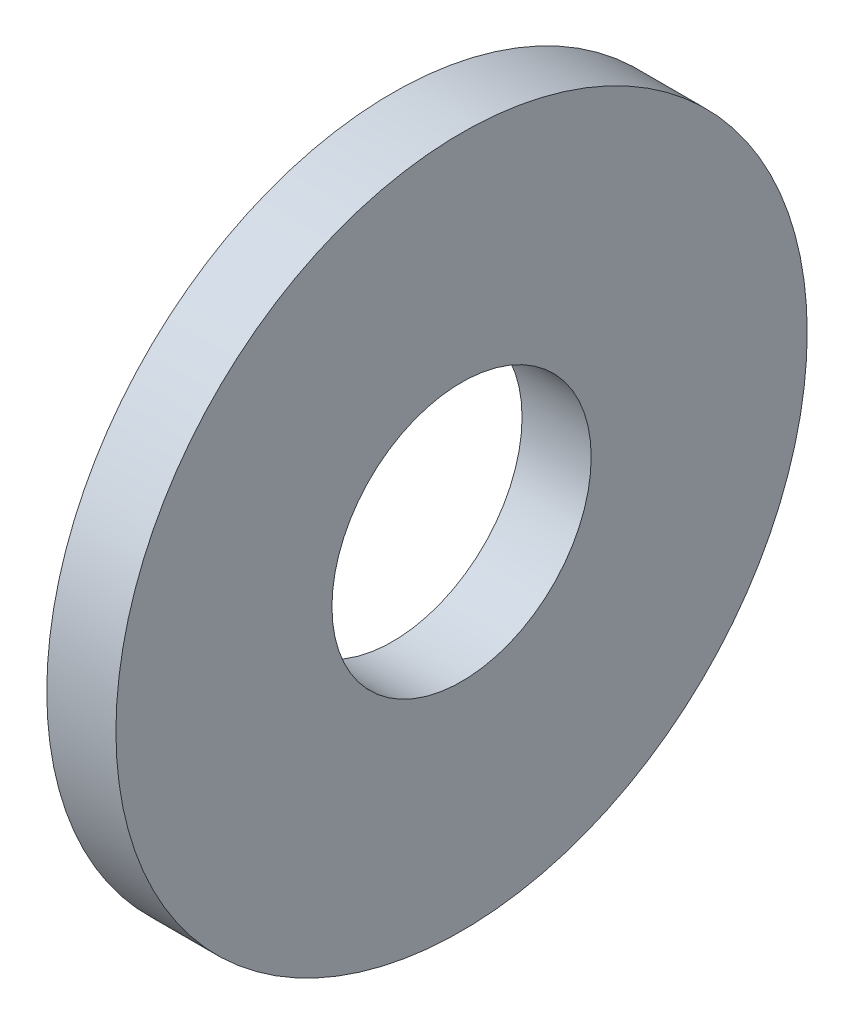
ISO-10303-21;
HEADER;
FILE_DESCRIPTION(('STEP AP214'),'2;1');
FILE_NAME('part.step','',(''),(''),'','','');
FILE_SCHEMA(('AUTOMOTIVE_DESIGN { 1 0 10303 214 1 1 1 1 }'));
ENDSEC;
DATA;
#1=APPLICATION_CONTEXT('core data for automotive mechanical design processes');
#2=APPLICATION_PROTOCOL_DEFINITION('international standard','automotive_design',2000,#1);
#3=PRODUCT_CONTEXT('',#1,'mechanical');
#4=PRODUCT('Part','Part','',(#3));
#5=PRODUCT_RELATED_PRODUCT_CATEGORY('part','',(#4));
#6=PRODUCT_DEFINITION_FORMATION('','',#4);
#7=PRODUCT_DEFINITION_CONTEXT('part definition',#1,'design');
#8=PRODUCT_DEFINITION('design','',#6,#7);
#9=PRODUCT_DEFINITION_SHAPE('','',#8);
#10=(LENGTH_UNIT() NAMED_UNIT(*) SI_UNIT(.MILLI.,.METRE.));
#11=(NAMED_UNIT(*) PLANE_ANGLE_UNIT() SI_UNIT($,.RADIAN.));
#12=(NAMED_UNIT(*) SI_UNIT($,.STERADIAN.) SOLID_ANGLE_UNIT());
#13=UNCERTAINTY_MEASURE_WITH_UNIT(LENGTH_MEASURE(1.E-05),#10,'distance_accuracy_value','');
#14=(GEOMETRIC_REPRESENTATION_CONTEXT(3) GLOBAL_UNCERTAINTY_ASSIGNED_CONTEXT((#13)) GLOBAL_UNIT_ASSIGNED_CONTEXT((#10,
#11,#12)) REPRESENTATION_CONTEXT('',''));
#15=CARTESIAN_POINT('',(0.,0.,0.));
#16=DIRECTION('',(0.,0.,1.));
#17=DIRECTION('',(1.,0.,0.));
#18=AXIS2_PLACEMENT_3D('',#15,#16,#17);
#19=CARTESIAN_POINT('',(2.54,0.,0.));
#20=DIRECTION('',(1.,0.,0.));
#21=DIRECTION('',(0.,0.,-1.));
#22=AXIS2_PLACEMENT_3D('',#19,#20,#21);
#23=PLANE('',#22);
#24=CARTESIAN_POINT('',(2.54,0.,0.));
#25=DIRECTION('',(1.,0.,0.));
#26=DIRECTION('',(0.,0.,-1.));
#27=AXIS2_PLACEMENT_3D('',#24,#25,#26);
#28=CIRCLE('',#27,12.7);
#29=CARTESIAN_POINT('',(2.54,0.,-12.7));
#30=VERTEX_POINT('',#29);
#31=EDGE_CURVE('E10',#30,#30,#28,.T.);
#32=ORIENTED_EDGE('',*,*,#31,.T.);
#33=EDGE_LOOP('',(#32));
#34=FACE_BOUND('',#33,.T.);
#35=CARTESIAN_POINT('',(2.54,0.,0.));
#36=DIRECTION('',(1.,0.,0.));
#37=DIRECTION('',(0.,0.,-1.));
#38=AXIS2_PLACEMENT_3D('',#35,#36,#37);
#39=CIRCLE('',#38,4.7625);
#40=CARTESIAN_POINT('',(2.54,0.,-4.7625));
#41=VERTEX_POINT('',#40);
#42=EDGE_CURVE('E42',#41,#41,#39,.T.);
#43=ORIENTED_EDGE('',*,*,#42,.F.);
#44=EDGE_LOOP('',(#43));
#45=FACE_BOUND('',#44,.T.);
#46=ADVANCED_FACE('F31',(#34,#45),#23,.T.);
#47=CARTESIAN_POINT('',(0.,0.,0.));
#48=DIRECTION('',(1.,0.,0.));
#49=DIRECTION('',(0.,0.,-1.));
#50=AXIS2_PLACEMENT_3D('',#47,#48,#49);
#51=PLANE('',#50);
#52=CARTESIAN_POINT('',(0.,0.,0.));
#53=DIRECTION('',(1.,0.,0.));
#54=DIRECTION('',(0.,0.,-1.));
#55=AXIS2_PLACEMENT_3D('',#52,#53,#54);
#56=CIRCLE('',#55,12.7);
#57=CARTESIAN_POINT('',(0.,0.,-12.7));
#58=VERTEX_POINT('',#57);
#59=EDGE_CURVE('E35',#58,#58,#56,.T.);
#60=ORIENTED_EDGE('',*,*,#59,.F.);
#61=EDGE_LOOP('',(#60));
#62=FACE_BOUND('',#61,.T.);
#63=CARTESIAN_POINT('',(0.,0.,0.));
#64=DIRECTION('',(1.,0.,0.));
#65=DIRECTION('',(0.,0.,-1.));
#66=AXIS2_PLACEMENT_3D('',#63,#64,#65);
#67=CIRCLE('',#66,4.7625);
#68=CARTESIAN_POINT('',(0.,0.,-4.7625));
#69=VERTEX_POINT('',#68);
#70=EDGE_CURVE('E44',#69,#69,#67,.T.);
#71=ORIENTED_EDGE('',*,*,#70,.T.);
#72=EDGE_LOOP('',(#71));
#73=FACE_BOUND('',#72,.T.);
#74=ADVANCED_FACE('F54',(#62,#73),#51,.F.);
#75=CARTESIAN_POINT('',(2.54,0.,0.));
#76=DIRECTION('',(-1.,0.,0.));
#77=DIRECTION('',(0.,0.,1.));
#78=AXIS2_PLACEMENT_3D('',#75,#76,#77);
#79=CYLINDRICAL_SURFACE('',#78,12.7);
#80=ORIENTED_EDGE('',*,*,#31,.F.);
#81=EDGE_LOOP('',(#80));
#82=FACE_BOUND('',#81,.T.);
#83=ORIENTED_EDGE('',*,*,#59,.T.);
#84=EDGE_LOOP('',(#83));
#85=FACE_BOUND('',#84,.T.);
#86=ADVANCED_FACE('F33',(#82,#85),#79,.T.);
#87=CARTESIAN_POINT('',(2.54,0.,0.));
#88=DIRECTION('',(-1.,0.,0.));
#89=DIRECTION('',(0.,0.,1.));
#90=AXIS2_PLACEMENT_3D('',#87,#88,#89);
#91=CYLINDRICAL_SURFACE('',#90,4.7625);
#92=ORIENTED_EDGE('',*,*,#42,.T.);
#93=EDGE_LOOP('',(#92));
#94=FACE_BOUND('',#93,.T.);
#95=ORIENTED_EDGE('',*,*,#70,.F.);
#96=EDGE_LOOP('',(#95));
#97=FACE_BOUND('',#96,.T.);
#98=ADVANCED_FACE('F50',(#94,#97),#91,.F.);
#99=CLOSED_SHELL('',(#46,#74,#86,#98));
#100=MANIFOLD_SOLID_BREP('B2',#99);
#101=ADVANCED_BREP_SHAPE_REPRESENTATION('',(#18,#100),#14);
#102=SHAPE_DEFINITION_REPRESENTATION(#9,#101);
ENDSEC;
END-ISO-10303-21;
